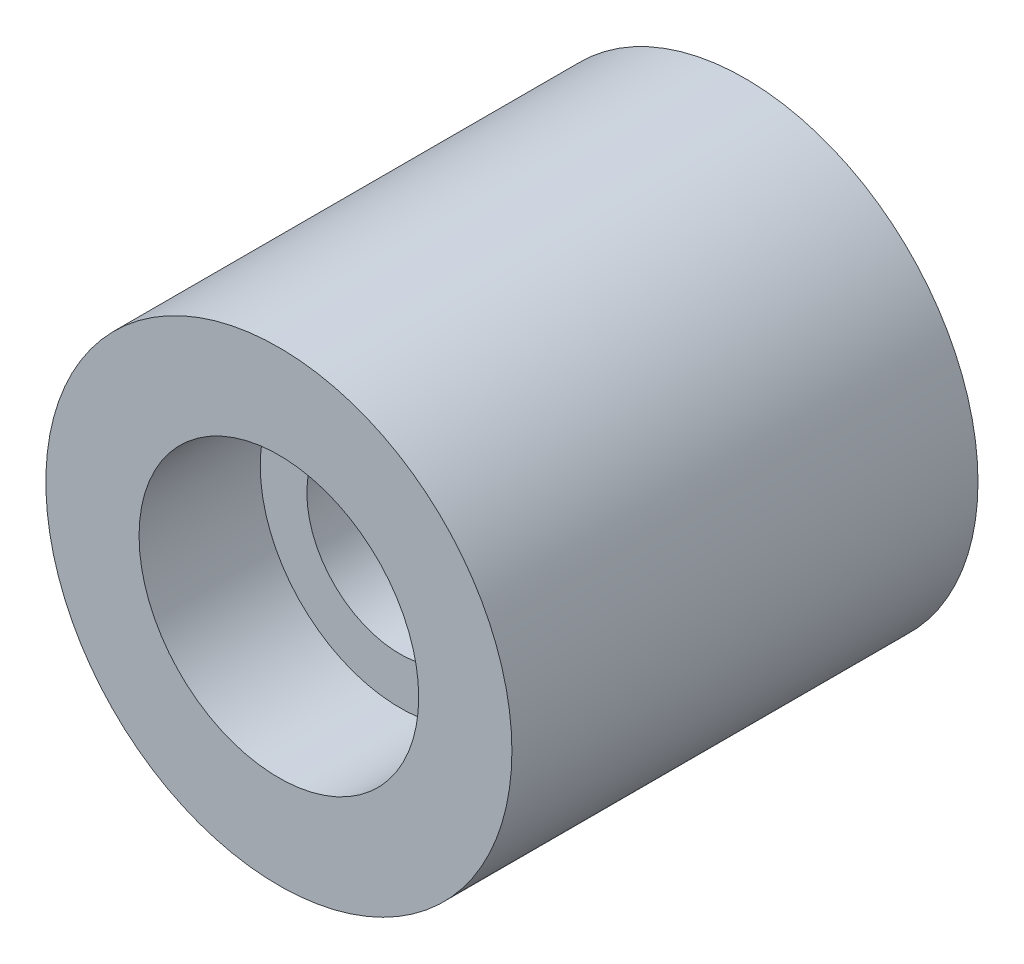
ISO-10303-21;
HEADER;
FILE_DESCRIPTION(('STEP AP214'),'2;1');
FILE_NAME('part.step','',(''),(''),'','','');
FILE_SCHEMA(('AUTOMOTIVE_DESIGN { 1 0 10303 214 1 1 1 1 }'));
ENDSEC;
DATA;
#1=APPLICATION_CONTEXT('core data for automotive mechanical design processes');
#2=APPLICATION_PROTOCOL_DEFINITION('international standard','automotive_design',2000,#1);
#3=PRODUCT_CONTEXT('',#1,'mechanical');
#4=PRODUCT('Part','Part','',(#3));
#5=PRODUCT_RELATED_PRODUCT_CATEGORY('part','',(#4));
#6=PRODUCT_DEFINITION_FORMATION('','',#4);
#7=PRODUCT_DEFINITION_CONTEXT('part definition',#1,'design');
#8=PRODUCT_DEFINITION('design','',#6,#7);
#9=PRODUCT_DEFINITION_SHAPE('','',#8);
#10=(LENGTH_UNIT() NAMED_UNIT(*) SI_UNIT(.MILLI.,.METRE.));
#11=(NAMED_UNIT(*) PLANE_ANGLE_UNIT() SI_UNIT($,.RADIAN.));
#12=(NAMED_UNIT(*) SI_UNIT($,.STERADIAN.) SOLID_ANGLE_UNIT());
#13=UNCERTAINTY_MEASURE_WITH_UNIT(LENGTH_MEASURE(1.E-05),#10,'distance_accuracy_value','');
#14=(GEOMETRIC_REPRESENTATION_CONTEXT(3) GLOBAL_UNCERTAINTY_ASSIGNED_CONTEXT((#13)) GLOBAL_UNIT_ASSIGNED_CONTEXT((#10,
#11,#12)) REPRESENTATION_CONTEXT('',''));
#15=CARTESIAN_POINT('',(0.,0.,0.));
#16=DIRECTION('',(0.,0.,1.));
#17=DIRECTION('',(1.,0.,0.));
#18=AXIS2_PLACEMENT_3D('',#15,#16,#17);
#19=CARTESIAN_POINT('',(0.,0.,0.));
#20=DIRECTION('',(0.,0.,1.));
#21=DIRECTION('',(1.,0.,0.));
#22=AXIS2_PLACEMENT_3D('',#19,#20,#21);
#23=CYLINDRICAL_SURFACE('',#22,1.5);
#24=CARTESIAN_POINT('',(0.,0.,-1.3));
#25=DIRECTION('',(0.,0.,1.));
#26=DIRECTION('',(1.,0.,0.));
#27=AXIS2_PLACEMENT_3D('',#24,#25,#26);
#28=CIRCLE('',#27,1.5);
#29=CARTESIAN_POINT('',(1.5,0.,-1.3));
#30=VERTEX_POINT('',#29);
#31=EDGE_CURVE('E66',#30,#30,#28,.T.);
#32=ORIENTED_EDGE('',*,*,#31,.F.);
#33=EDGE_LOOP('',(#32));
#34=FACE_BOUND('',#33,.T.);
#35=CARTESIAN_POINT('',(0.,0.,0.));
#36=DIRECTION('',(0.,0.,1.));
#37=DIRECTION('',(1.,0.,0.));
#38=AXIS2_PLACEMENT_3D('',#35,#36,#37);
#39=CIRCLE('',#38,1.5);
#40=CARTESIAN_POINT('',(1.5,0.,0.));
#41=VERTEX_POINT('',#40);
#42=EDGE_CURVE('E10',#41,#41,#39,.T.);
#43=ORIENTED_EDGE('',*,*,#42,.T.);
#44=EDGE_LOOP('',(#43));
#45=FACE_BOUND('',#44,.T.);
#46=ADVANCED_FACE('F32',(#34,#45),#23,.F.);
#47=CARTESIAN_POINT('',(-1.5,0.,0.));
#48=DIRECTION('',(0.,0.,-1.));
#49=DIRECTION('',(-1.,0.,0.));
#50=AXIS2_PLACEMENT_3D('',#47,#48,#49);
#51=PLANE('',#50);
#52=ORIENTED_EDGE('',*,*,#42,.F.);
#53=EDGE_LOOP('',(#52));
#54=FACE_BOUND('',#53,.T.);
#55=CARTESIAN_POINT('',(0.,0.,0.));
#56=DIRECTION('',(0.,0.,1.));
#57=DIRECTION('',(1.,0.,0.));
#58=AXIS2_PLACEMENT_3D('',#55,#56,#57);
#59=CIRCLE('',#58,2.5);
#60=CARTESIAN_POINT('',(2.5,0.,0.));
#61=VERTEX_POINT('',#60);
#62=EDGE_CURVE('E38',#61,#61,#59,.T.);
#63=ORIENTED_EDGE('',*,*,#62,.T.);
#64=EDGE_LOOP('',(#63));
#65=FACE_BOUND('',#64,.T.);
#66=ADVANCED_FACE('F73',(#54,#65),#51,.F.);
#67=CARTESIAN_POINT('',(0.,0.,0.));
#68=DIRECTION('',(0.,0.,1.));
#69=DIRECTION('',(1.,0.,0.));
#70=AXIS2_PLACEMENT_3D('',#67,#68,#69);
#71=CYLINDRICAL_SURFACE('',#70,2.5);
#72=ORIENTED_EDGE('',*,*,#62,.F.);
#73=EDGE_LOOP('',(#72));
#74=FACE_BOUND('',#73,.T.);
#75=CARTESIAN_POINT('',(0.,0.,-5.));
#76=DIRECTION('',(0.,0.,1.));
#77=DIRECTION('',(1.,0.,0.));
#78=AXIS2_PLACEMENT_3D('',#75,#76,#77);
#79=CIRCLE('',#78,2.5);
#80=CARTESIAN_POINT('',(2.5,0.,-5.));
#81=VERTEX_POINT('',#80);
#82=EDGE_CURVE('E42',#81,#81,#79,.T.);
#83=ORIENTED_EDGE('',*,*,#82,.T.);
#84=EDGE_LOOP('',(#83));
#85=FACE_BOUND('',#84,.T.);
#86=ADVANCED_FACE('F77',(#74,#85),#71,.T.);
#87=CARTESIAN_POINT('',(-2.5,0.,-5.));
#88=DIRECTION('',(0.,0.,1.));
#89=DIRECTION('',(1.,0.,0.));
#90=AXIS2_PLACEMENT_3D('',#87,#88,#89);
#91=PLANE('',#90);
#92=ORIENTED_EDGE('',*,*,#82,.F.);
#93=EDGE_LOOP('',(#92));
#94=FACE_BOUND('',#93,.T.);
#95=CARTESIAN_POINT('',(0.,0.,-5.));
#96=DIRECTION('',(0.,0.,1.));
#97=DIRECTION('',(1.,0.,0.));
#98=AXIS2_PLACEMENT_3D('',#95,#96,#97);
#99=CIRCLE('',#98,1.);
#100=CARTESIAN_POINT('',(1.,0.,-5.));
#101=VERTEX_POINT('',#100);
#102=EDGE_CURVE('E46',#101,#101,#99,.T.);
#103=ORIENTED_EDGE('',*,*,#102,.T.);
#104=EDGE_LOOP('',(#103));
#105=FACE_BOUND('',#104,.T.);
#106=ADVANCED_FACE('F82',(#94,#105),#91,.F.);
#107=CARTESIAN_POINT('',(0.,0.,0.));
#108=DIRECTION('',(0.,0.,1.));
#109=DIRECTION('',(1.,0.,0.));
#110=AXIS2_PLACEMENT_3D('',#107,#108,#109);
#111=CYLINDRICAL_SURFACE('',#110,1.);
#112=ORIENTED_EDGE('',*,*,#102,.F.);
#113=EDGE_LOOP('',(#112));
#114=FACE_BOUND('',#113,.T.);
#115=CARTESIAN_POINT('',(0.,0.,-4.5));
#116=DIRECTION('',(0.,0.,1.));
#117=DIRECTION('',(1.,0.,0.));
#118=AXIS2_PLACEMENT_3D('',#115,#116,#117);
#119=CIRCLE('',#118,1.);
#120=CARTESIAN_POINT('',(1.,0.,-4.5));
#121=VERTEX_POINT('',#120);
#122=EDGE_CURVE('E51',#121,#121,#119,.T.);
#123=ORIENTED_EDGE('',*,*,#122,.T.);
#124=EDGE_LOOP('',(#123));
#125=FACE_BOUND('',#124,.T.);
#126=ADVANCED_FACE('F88',(#114,#125),#111,.F.);
#127=CARTESIAN_POINT('',(-2.,0.,-4.5));
#128=DIRECTION('',(0.,0.,-1.));
#129=DIRECTION('',(-1.,0.,0.));
#130=AXIS2_PLACEMENT_3D('',#127,#128,#129);
#131=PLANE('',#130);
#132=ORIENTED_EDGE('',*,*,#122,.F.);
#133=EDGE_LOOP('',(#132));
#134=FACE_BOUND('',#133,.T.);
#135=CARTESIAN_POINT('',(0.,0.,-4.5));
#136=DIRECTION('',(0.,0.,1.));
#137=DIRECTION('',(1.,0.,0.));
#138=AXIS2_PLACEMENT_3D('',#135,#136,#137);
#139=CIRCLE('',#138,2.);
#140=CARTESIAN_POINT('',(2.,0.,-4.5));
#141=VERTEX_POINT('',#140);
#142=EDGE_CURVE('E54',#141,#141,#139,.T.);
#143=ORIENTED_EDGE('',*,*,#142,.T.);
#144=EDGE_LOOP('',(#143));
#145=FACE_BOUND('',#144,.T.);
#146=ADVANCED_FACE('F92',(#134,#145),#131,.F.);
#147=CARTESIAN_POINT('',(0.,0.,0.));
#148=DIRECTION('',(0.,0.,1.));
#149=DIRECTION('',(1.,0.,0.));
#150=AXIS2_PLACEMENT_3D('',#147,#148,#149);
#151=CYLINDRICAL_SURFACE('',#150,2.);
#152=ORIENTED_EDGE('',*,*,#142,.F.);
#153=EDGE_LOOP('',(#152));
#154=FACE_BOUND('',#153,.T.);
#155=CARTESIAN_POINT('',(0.,0.,-1.8));
#156=DIRECTION('',(0.,0.,1.));
#157=DIRECTION('',(1.,0.,0.));
#158=AXIS2_PLACEMENT_3D('',#155,#156,#157);
#159=CIRCLE('',#158,2.);
#160=CARTESIAN_POINT('',(2.,0.,-1.8));
#161=VERTEX_POINT('',#160);
#162=EDGE_CURVE('E57',#161,#161,#159,.T.);
#163=ORIENTED_EDGE('',*,*,#162,.T.);
#164=EDGE_LOOP('',(#163));
#165=FACE_BOUND('',#164,.T.);
#166=ADVANCED_FACE('F96',(#154,#165),#151,.F.);
#167=CARTESIAN_POINT('',(-2.,0.,-1.8));
#168=DIRECTION('',(0.,0.,1.));
#169=DIRECTION('',(1.,0.,0.));
#170=AXIS2_PLACEMENT_3D('',#167,#168,#169);
#171=PLANE('',#170);
#172=ORIENTED_EDGE('',*,*,#162,.F.);
#173=EDGE_LOOP('',(#172));
#174=FACE_BOUND('',#173,.T.);
#175=CARTESIAN_POINT('',(0.,0.,-1.8));
#176=DIRECTION('',(0.,0.,1.));
#177=DIRECTION('',(1.,0.,0.));
#178=AXIS2_PLACEMENT_3D('',#175,#176,#177);
#179=CIRCLE('',#178,1.);
#180=CARTESIAN_POINT('',(1.,0.,-1.8));
#181=VERTEX_POINT('',#180);
#182=EDGE_CURVE('E60',#181,#181,#179,.T.);
#183=ORIENTED_EDGE('',*,*,#182,.T.);
#184=EDGE_LOOP('',(#183));
#185=FACE_BOUND('',#184,.T.);
#186=ADVANCED_FACE('F100',(#174,#185),#171,.F.);
#187=CARTESIAN_POINT('',(0.,0.,0.));
#188=DIRECTION('',(0.,0.,1.));
#189=DIRECTION('',(1.,0.,0.));
#190=AXIS2_PLACEMENT_3D('',#187,#188,#189);
#191=CYLINDRICAL_SURFACE('',#190,1.);
#192=ORIENTED_EDGE('',*,*,#182,.F.);
#193=EDGE_LOOP('',(#192));
#194=FACE_BOUND('',#193,.T.);
#195=CARTESIAN_POINT('',(0.,0.,-1.3));
#196=DIRECTION('',(0.,0.,1.));
#197=DIRECTION('',(1.,0.,0.));
#198=AXIS2_PLACEMENT_3D('',#195,#196,#197);
#199=CIRCLE('',#198,1.);
#200=CARTESIAN_POINT('',(1.,0.,-1.3));
#201=VERTEX_POINT('',#200);
#202=EDGE_CURVE('E63',#201,#201,#199,.T.);
#203=ORIENTED_EDGE('',*,*,#202,.T.);
#204=EDGE_LOOP('',(#203));
#205=FACE_BOUND('',#204,.T.);
#206=ADVANCED_FACE('F104',(#194,#205),#191,.F.);
#207=CARTESIAN_POINT('',(-1.5,0.,-1.3));
#208=DIRECTION('',(0.,0.,-1.));
#209=DIRECTION('',(-1.,0.,0.));
#210=AXIS2_PLACEMENT_3D('',#207,#208,#209);
#211=PLANE('',#210);
#212=ORIENTED_EDGE('',*,*,#202,.F.);
#213=EDGE_LOOP('',(#212));
#214=FACE_BOUND('',#213,.T.);
#215=ORIENTED_EDGE('',*,*,#31,.T.);
#216=EDGE_LOOP('',(#215));
#217=FACE_BOUND('',#216,.T.);
#218=ADVANCED_FACE('F70',(#214,#217),#211,.F.);
#219=CLOSED_SHELL('',(#46,#66,#86,#106,#126,#146,#166,#186,#206,#218));
#220=MANIFOLD_SOLID_BREP('B2',#219);
#221=ADVANCED_BREP_SHAPE_REPRESENTATION('',(#18,#220),#14);
#222=SHAPE_DEFINITION_REPRESENTATION(#9,#221);
ENDSEC;
END-ISO-10303-21;
